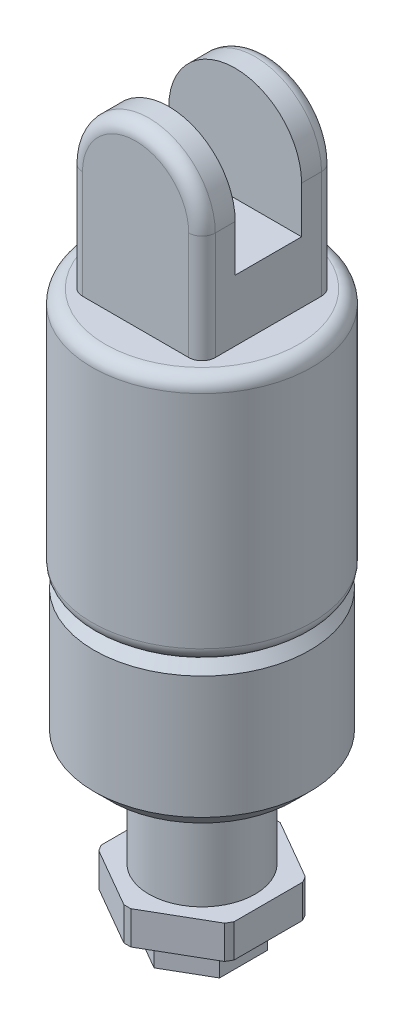
ISO-10303-21;
HEADER;
FILE_DESCRIPTION(('STEP AP214'),'2;1');
FILE_NAME('part.step','',(''),(''),'','','');
FILE_SCHEMA(('AUTOMOTIVE_DESIGN { 1 0 10303 214 1 1 1 1 }'));
ENDSEC;
DATA;
#1=APPLICATION_CONTEXT('core data for automotive mechanical design processes');
#2=APPLICATION_PROTOCOL_DEFINITION('international standard','automotive_design',2000,#1);
#3=PRODUCT_CONTEXT('',#1,'mechanical');
#4=PRODUCT('Part','Part','',(#3));
#5=PRODUCT_RELATED_PRODUCT_CATEGORY('part','',(#4));
#6=PRODUCT_DEFINITION_FORMATION('','',#4);
#7=PRODUCT_DEFINITION_CONTEXT('part definition',#1,'design');
#8=PRODUCT_DEFINITION('design','',#6,#7);
#9=PRODUCT_DEFINITION_SHAPE('','',#8);
#10=(LENGTH_UNIT() NAMED_UNIT(*) SI_UNIT(.MILLI.,.METRE.));
#11=(NAMED_UNIT(*) PLANE_ANGLE_UNIT() SI_UNIT($,.RADIAN.));
#12=(NAMED_UNIT(*) SI_UNIT($,.STERADIAN.) SOLID_ANGLE_UNIT());
#13=UNCERTAINTY_MEASURE_WITH_UNIT(LENGTH_MEASURE(1.E-05),#10,'distance_accuracy_value','');
#14=(GEOMETRIC_REPRESENTATION_CONTEXT(3) GLOBAL_UNCERTAINTY_ASSIGNED_CONTEXT((#13)) GLOBAL_UNIT_ASSIGNED_CONTEXT((#10,
#11,#12)) REPRESENTATION_CONTEXT('',''));
#15=CARTESIAN_POINT('',(0.,0.,0.));
#16=DIRECTION('',(0.,0.,1.));
#17=DIRECTION('',(1.,0.,0.));
#18=AXIS2_PLACEMENT_3D('',#15,#16,#17);
#19=CARTESIAN_POINT('',(0.,30.5,4.));
#20=DIRECTION('',(0.,0.,-1.));
#21=DIRECTION('',(-1.,0.,0.));
#22=AXIS2_PLACEMENT_3D('',#19,#20,#21);
#23=CYLINDRICAL_SURFACE('',#22,4.);
#24=DIRECTION('',(0.,0.,-1.));
#25=VECTOR('',#24,1.);
#26=CARTESIAN_POINT('',(4.,30.5,4.));
#27=LINE('',#26,#25);
#28=CARTESIAN_POINT('',(4.,30.5,3.2));
#29=VERTEX_POINT('',#28);
#30=CARTESIAN_POINT('',(4.,30.5,2.));
#31=VERTEX_POINT('',#30);
#32=EDGE_CURVE('E296',#29,#31,#27,.T.);
#33=ORIENTED_EDGE('',*,*,#32,.T.);
#34=CARTESIAN_POINT('',(0.,30.5,2.));
#35=DIRECTION('',(0.,0.,1.));
#36=DIRECTION('',(0.,-1.,0.));
#37=AXIS2_PLACEMENT_3D('',#34,#35,#36);
#38=CIRCLE('',#37,4.);
#39=CARTESIAN_POINT('',(-4.,30.5,2.));
#40=VERTEX_POINT('',#39);
#41=EDGE_CURVE('E56',#31,#40,#38,.T.);
#42=ORIENTED_EDGE('',*,*,#41,.T.);
#43=DIRECTION('',(0.,0.,-1.));
#44=VECTOR('',#43,1.);
#45=CARTESIAN_POINT('',(-4.,30.5,4.));
#46=LINE('',#45,#44);
#47=CARTESIAN_POINT('',(-4.,30.5,3.2));
#48=VERTEX_POINT('',#47);
#49=EDGE_CURVE('E292',#48,#40,#46,.T.);
#50=ORIENTED_EDGE('',*,*,#49,.F.);
#51=CARTESIAN_POINT('',(0.,30.5,3.2));
#52=DIRECTION('',(0.,0.,1.));
#53=DIRECTION('',(1.,0.,0.));
#54=AXIS2_PLACEMENT_3D('',#51,#52,#53);
#55=CIRCLE('',#54,4.);
#56=EDGE_CURVE('E519',#48,#29,#55,.F.);
#57=ORIENTED_EDGE('',*,*,#56,.T.);
#58=EDGE_LOOP('',(#33,#42,#50,#57));
#59=FACE_BOUND('',#58,.T.);
#60=ADVANCED_FACE('F47',(#59),#23,.T.);
#61=CARTESIAN_POINT('',(3.2,-6.,0.));
#62=DIRECTION('',(0.,-1.,0.));
#63=DIRECTION('',(0.,0.,-1.));
#64=AXIS2_PLACEMENT_3D('',#61,#62,#63);
#65=PLANE('',#64);
#66=CARTESIAN_POINT('',(0.,-6.,0.));
#67=DIRECTION('',(0.,1.,0.));
#68=DIRECTION('',(0.,0.,1.));
#69=AXIS2_PLACEMENT_3D('',#66,#67,#68);
#70=CIRCLE('',#69,3.2);
#71=CARTESIAN_POINT('',(0.,-6.,3.2));
#72=VERTEX_POINT('',#71);
#73=EDGE_CURVE('E440',#72,#72,#70,.T.);
#74=ORIENTED_EDGE('',*,*,#73,.F.);
#75=EDGE_LOOP('',(#74));
#76=FACE_BOUND('',#75,.T.);
#77=DIRECTION('',(-0.866025403784439,0.,0.5));
#78=VECTOR('',#77,1.);
#79=CARTESIAN_POINT('',(4.4,-6.,2.07846096908265));
#80=LINE('',#79,#78);
#81=CARTESIAN_POINT('',(3.78535710713571,-6.,2.43332520873334));
#82=VERTEX_POINT('',#81);
#83=CARTESIAN_POINT('',(0.214642892864287,-6.,4.49487802154217));
#84=VERTEX_POINT('',#83);
#85=EDGE_CURVE('E422',#82,#84,#80,.T.);
#86=ORIENTED_EDGE('',*,*,#85,.F.);
#87=CARTESIAN_POINT('',(0.,-6.,0.));
#88=DIRECTION('',(0.,1.,0.));
#89=DIRECTION('',(0.,0.,1.));
#90=AXIS2_PLACEMENT_3D('',#87,#88,#89);
#91=CIRCLE('',#90,4.5);
#92=CARTESIAN_POINT('',(4.,-6.,2.06155281280883));
#93=VERTEX_POINT('',#92);
#94=EDGE_CURVE('E439',#82,#93,#91,.T.);
#95=ORIENTED_EDGE('',*,*,#94,.T.);
#96=DIRECTION('',(0.,0.,1.));
#97=VECTOR('',#96,1.);
#98=CARTESIAN_POINT('',(4.,-6.,0.));
#99=LINE('',#98,#97);
#100=CARTESIAN_POINT('',(4.,-6.,-2.06155281280883));
#101=VERTEX_POINT('',#100);
#102=EDGE_CURVE('E413',#101,#93,#99,.T.);
#103=ORIENTED_EDGE('',*,*,#102,.F.);
#104=CARTESIAN_POINT('',(3.78535710713571,-6.,-2.43332520873334));
#105=VERTEX_POINT('',#104);
#106=EDGE_CURVE('E824',#101,#105,#91,.T.);
#107=ORIENTED_EDGE('',*,*,#106,.T.);
#108=DIRECTION('',(0.866025403784439,0.,0.5));
#109=VECTOR('',#108,1.);
#110=CARTESIAN_POINT('',(4.4,-6.,-2.07846096908265));
#111=LINE('',#110,#109);
#112=CARTESIAN_POINT('',(0.214642892864289,-6.,-4.49487802154217));
#113=VERTEX_POINT('',#112);
#114=EDGE_CURVE('E404',#113,#105,#111,.T.);
#115=ORIENTED_EDGE('',*,*,#114,.F.);
#116=CARTESIAN_POINT('',(-0.214642892864292,-6.,-4.49487802154217));
#117=VERTEX_POINT('',#116);
#118=EDGE_CURVE('E794',#113,#117,#91,.T.);
#119=ORIENTED_EDGE('',*,*,#118,.T.);
#120=DIRECTION('',(0.866025403784439,0.,-0.5));
#121=VECTOR('',#120,1.);
#122=CARTESIAN_POINT('',(0.399999999999998,-6.,-4.84974226119286));
#123=LINE('',#122,#121);
#124=CARTESIAN_POINT('',(-3.78535710713571,-6.,-2.43332520873334));
#125=VERTEX_POINT('',#124);
#126=EDGE_CURVE('E395',#125,#117,#123,.T.);
#127=ORIENTED_EDGE('',*,*,#126,.F.);
#128=CARTESIAN_POINT('',(-4.,-6.,-2.06155281280883));
#129=VERTEX_POINT('',#128);
#130=EDGE_CURVE('E790',#125,#129,#91,.T.);
#131=ORIENTED_EDGE('',*,*,#130,.T.);
#132=DIRECTION('',(0.,0.,-1.));
#133=VECTOR('',#132,1.);
#134=CARTESIAN_POINT('',(-4.,-6.,0.));
#135=LINE('',#134,#133);
#136=CARTESIAN_POINT('',(-4.,-6.,2.06155281280883));
#137=VERTEX_POINT('',#136);
#138=EDGE_CURVE('E386',#137,#129,#135,.T.);
#139=ORIENTED_EDGE('',*,*,#138,.F.);
#140=CARTESIAN_POINT('',(-3.78535710713571,-6.,2.43332520873334));
#141=VERTEX_POINT('',#140);
#142=EDGE_CURVE('E438',#137,#141,#91,.T.);
#143=ORIENTED_EDGE('',*,*,#142,.T.);
#144=DIRECTION('',(-0.866025403784439,0.,-0.5));
#145=VECTOR('',#144,1.);
#146=CARTESIAN_POINT('',(0.400000000000001,-6.,4.84974226119286));
#147=LINE('',#146,#145);
#148=CARTESIAN_POINT('',(-0.214642892864286,-6.,4.49487802154217));
#149=VERTEX_POINT('',#148);
#150=EDGE_CURVE('E377',#149,#141,#147,.T.);
#151=ORIENTED_EDGE('',*,*,#150,.F.);
#152=EDGE_CURVE('E434',#149,#84,#91,.T.);
#153=ORIENTED_EDGE('',*,*,#152,.T.);
#154=EDGE_LOOP('',(#86,#95,#103,#107,#115,#119,#127,#131,#139,#143,#151,#153));
#155=FACE_BOUND('',#154,.T.);
#156=ADVANCED_FACE('F601',(#76,#155),#65,.F.);
#157=CARTESIAN_POINT('',(0.,0.,0.));
#158=DIRECTION('',(0.,1.,0.));
#159=DIRECTION('',(0.,0.,1.));
#160=AXIS2_PLACEMENT_3D('',#157,#158,#159);
#161=CYLINDRICAL_SURFACE('',#160,4.5);
#162=DIRECTION('',(0.,1.,0.));
#163=VECTOR('',#162,1.);
#164=CARTESIAN_POINT('',(3.78535710713571,0.,2.43332520873334));
#165=LINE('',#164,#163);
#166=CARTESIAN_POINT('',(3.78535710713571,-8.,2.43332520873334));
#167=VERTEX_POINT('',#166);
#168=EDGE_CURVE('E425',#167,#82,#165,.T.);
#169=ORIENTED_EDGE('',*,*,#168,.F.);
#170=CARTESIAN_POINT('',(0.,-8.,0.));
#171=DIRECTION('',(0.,1.,0.));
#172=DIRECTION('',(0.,0.,1.));
#173=AXIS2_PLACEMENT_3D('',#170,#171,#172);
#174=CIRCLE('',#173,4.5);
#175=CARTESIAN_POINT('',(4.,-8.,2.06155281280883));
#176=VERTEX_POINT('',#175);
#177=EDGE_CURVE('E433',#167,#176,#174,.T.);
#178=ORIENTED_EDGE('',*,*,#177,.T.);
#179=DIRECTION('',(0.,1.,0.));
#180=VECTOR('',#179,1.);
#181=CARTESIAN_POINT('',(4.,0.,2.06155281280883));
#182=LINE('',#181,#180);
#183=EDGE_CURVE('E410',#93,#176,#182,.F.);
#184=ORIENTED_EDGE('',*,*,#183,.F.);
#185=ORIENTED_EDGE('',*,*,#94,.F.);
#186=EDGE_LOOP('',(#169,#178,#184,#185));
#187=FACE_BOUND('',#186,.T.);
#188=ADVANCED_FACE('F607',(#187),#161,.T.);
#189=DIRECTION('',(0.,1.,0.));
#190=VECTOR('',#189,1.);
#191=CARTESIAN_POINT('',(0.214642892864287,0.,4.49487802154217));
#192=LINE('',#191,#190);
#193=CARTESIAN_POINT('',(0.214642892864289,-8.,4.49487802154217));
#194=VERTEX_POINT('',#193);
#195=EDGE_CURVE('E419',#84,#194,#192,.F.);
#196=ORIENTED_EDGE('',*,*,#195,.F.);
#197=ORIENTED_EDGE('',*,*,#152,.F.);
#198=DIRECTION('',(0.,1.,0.));
#199=VECTOR('',#198,1.);
#200=CARTESIAN_POINT('',(-0.214642892864284,0.,4.49487802154217));
#201=LINE('',#200,#199);
#202=CARTESIAN_POINT('',(-0.214642892864286,-8.,4.49487802154217));
#203=VERTEX_POINT('',#202);
#204=EDGE_CURVE('E380',#203,#149,#201,.T.);
#205=ORIENTED_EDGE('',*,*,#204,.F.);
#206=EDGE_CURVE('E428',#203,#194,#174,.T.);
#207=ORIENTED_EDGE('',*,*,#206,.T.);
#208=EDGE_LOOP('',(#196,#197,#205,#207));
#209=FACE_BOUND('',#208,.T.);
#210=ADVANCED_FACE('F673',(#209),#161,.T.);
#211=DIRECTION('',(0.,1.,0.));
#212=VECTOR('',#211,1.);
#213=CARTESIAN_POINT('',(4.,0.,-2.06155281280883));
#214=LINE('',#213,#212);
#215=CARTESIAN_POINT('',(4.,-8.,-2.06155281280883));
#216=VERTEX_POINT('',#215);
#217=EDGE_CURVE('E416',#216,#101,#214,.T.);
#218=ORIENTED_EDGE('',*,*,#217,.F.);
#219=CARTESIAN_POINT('',(3.78535710713571,-8.,-2.43332520873334));
#220=VERTEX_POINT('',#219);
#221=EDGE_CURVE('E806',#216,#220,#174,.T.);
#222=ORIENTED_EDGE('',*,*,#221,.T.);
#223=DIRECTION('',(0.,1.,0.));
#224=VECTOR('',#223,1.);
#225=CARTESIAN_POINT('',(3.78535710713571,0.,-2.43332520873334));
#226=LINE('',#225,#224);
#227=EDGE_CURVE('E401',#105,#220,#226,.F.);
#228=ORIENTED_EDGE('',*,*,#227,.F.);
#229=ORIENTED_EDGE('',*,*,#106,.F.);
#230=EDGE_LOOP('',(#218,#222,#228,#229));
#231=FACE_BOUND('',#230,.T.);
#232=ADVANCED_FACE('F906',(#231),#161,.T.);
#233=DIRECTION('',(0.,1.,0.));
#234=VECTOR('',#233,1.);
#235=CARTESIAN_POINT('',(0.214642892864286,0.,-4.49487802154217));
#236=LINE('',#235,#234);
#237=CARTESIAN_POINT('',(0.214642892864289,-8.,-4.49487802154217));
#238=VERTEX_POINT('',#237);
#239=EDGE_CURVE('E407',#238,#113,#236,.T.);
#240=ORIENTED_EDGE('',*,*,#239,.F.);
#241=CARTESIAN_POINT('',(-0.214642892864292,-8.,-4.49487802154217));
#242=VERTEX_POINT('',#241);
#243=EDGE_CURVE('E802',#238,#242,#174,.T.);
#244=ORIENTED_EDGE('',*,*,#243,.T.);
#245=DIRECTION('',(0.,1.,0.));
#246=VECTOR('',#245,1.);
#247=CARTESIAN_POINT('',(-0.214642892864292,0.,-4.49487802154217));
#248=LINE('',#247,#246);
#249=EDGE_CURVE('E392',#117,#242,#248,.F.);
#250=ORIENTED_EDGE('',*,*,#249,.F.);
#251=ORIENTED_EDGE('',*,*,#118,.F.);
#252=EDGE_LOOP('',(#240,#244,#250,#251));
#253=FACE_BOUND('',#252,.T.);
#254=ADVANCED_FACE('F860',(#253),#161,.T.);
#255=DIRECTION('',(0.,1.,0.));
#256=VECTOR('',#255,1.);
#257=CARTESIAN_POINT('',(-3.78535710713571,0.,-2.43332520873334));
#258=LINE('',#257,#256);
#259=CARTESIAN_POINT('',(-3.78535710713571,-8.,-2.43332520873334));
#260=VERTEX_POINT('',#259);
#261=EDGE_CURVE('E398',#260,#125,#258,.T.);
#262=ORIENTED_EDGE('',*,*,#261,.F.);
#263=CARTESIAN_POINT('',(-4.,-8.,-2.06155281280883));
#264=VERTEX_POINT('',#263);
#265=EDGE_CURVE('E787',#260,#264,#174,.T.);
#266=ORIENTED_EDGE('',*,*,#265,.T.);
#267=DIRECTION('',(0.,1.,0.));
#268=VECTOR('',#267,1.);
#269=CARTESIAN_POINT('',(-4.,0.,-2.06155281280883));
#270=LINE('',#269,#268);
#271=EDGE_CURVE('E383',#129,#264,#270,.F.);
#272=ORIENTED_EDGE('',*,*,#271,.F.);
#273=ORIENTED_EDGE('',*,*,#130,.F.);
#274=EDGE_LOOP('',(#262,#266,#272,#273));
#275=FACE_BOUND('',#274,.T.);
#276=ADVANCED_FACE('F913',(#275),#161,.T.);
#277=DIRECTION('',(0.,1.,0.));
#278=VECTOR('',#277,1.);
#279=CARTESIAN_POINT('',(-4.,0.,2.06155281280883));
#280=LINE('',#279,#278);
#281=CARTESIAN_POINT('',(-4.,-8.,2.06155281280883));
#282=VERTEX_POINT('',#281);
#283=EDGE_CURVE('E389',#282,#137,#280,.T.);
#284=ORIENTED_EDGE('',*,*,#283,.F.);
#285=CARTESIAN_POINT('',(-3.78535710713571,-8.,2.43332520873334));
#286=VERTEX_POINT('',#285);
#287=EDGE_CURVE('E432',#282,#286,#174,.T.);
#288=ORIENTED_EDGE('',*,*,#287,.T.);
#289=DIRECTION('',(0.,1.,0.));
#290=VECTOR('',#289,1.);
#291=CARTESIAN_POINT('',(-3.78535710713571,0.,2.43332520873334));
#292=LINE('',#291,#290);
#293=EDGE_CURVE('E350',#141,#286,#292,.F.);
#294=ORIENTED_EDGE('',*,*,#293,.F.);
#295=ORIENTED_EDGE('',*,*,#142,.F.);
#296=EDGE_LOOP('',(#284,#288,#294,#295));
#297=FACE_BOUND('',#296,.T.);
#298=ADVANCED_FACE('F670',(#297),#161,.T.);
#299=CARTESIAN_POINT('',(4.5,-8.,0.));
#300=DIRECTION('',(0.,1.,0.));
#301=DIRECTION('',(0.,0.,1.));
#302=AXIS2_PLACEMENT_3D('',#299,#300,#301);
#303=PLANE('',#302);
#304=DIRECTION('',(0.866025403784439,0.,-0.5));
#305=VECTOR('',#304,1.);
#306=CARTESIAN_POINT('',(5.375,-8.,1.51554445662277));
#307=LINE('',#306,#305);
#308=EDGE_CURVE('E495',#194,#167,#307,.T.);
#309=ORIENTED_EDGE('',*,*,#308,.F.);
#310=ORIENTED_EDGE('',*,*,#206,.F.);
#311=DIRECTION('',(0.866025403784439,0.,0.5));
#312=VECTOR('',#311,1.);
#313=CARTESIAN_POINT('',(1.375,-8.,5.41265877365274));
#314=LINE('',#313,#312);
#315=EDGE_CURVE('E480',#286,#203,#314,.T.);
#316=ORIENTED_EDGE('',*,*,#315,.F.);
#317=ORIENTED_EDGE('',*,*,#287,.F.);
#318=DIRECTION('',(0.,0.,1.));
#319=VECTOR('',#318,1.);
#320=CARTESIAN_POINT('',(-4.,-8.,0.));
#321=LINE('',#320,#319);
#322=EDGE_CURVE('E483',#264,#282,#321,.T.);
#323=ORIENTED_EDGE('',*,*,#322,.F.);
#324=ORIENTED_EDGE('',*,*,#265,.F.);
#325=DIRECTION('',(-0.866025403784439,0.,0.5));
#326=VECTOR('',#325,1.);
#327=CARTESIAN_POINT('',(1.375,-8.,-5.41265877365274));
#328=LINE('',#327,#326);
#329=EDGE_CURVE('E486',#242,#260,#328,.T.);
#330=ORIENTED_EDGE('',*,*,#329,.F.);
#331=ORIENTED_EDGE('',*,*,#243,.F.);
#332=DIRECTION('',(-0.866025403784439,0.,-0.5));
#333=VECTOR('',#332,1.);
#334=CARTESIAN_POINT('',(5.375,-8.,-1.51554445662277));
#335=LINE('',#334,#333);
#336=EDGE_CURVE('E489',#220,#238,#335,.T.);
#337=ORIENTED_EDGE('',*,*,#336,.F.);
#338=ORIENTED_EDGE('',*,*,#221,.F.);
#339=DIRECTION('',(0.,0.,-1.));
#340=VECTOR('',#339,1.);
#341=CARTESIAN_POINT('',(4.,-8.,0.));
#342=LINE('',#341,#340);
#343=EDGE_CURVE('E492',#176,#216,#342,.T.);
#344=ORIENTED_EDGE('',*,*,#343,.F.);
#345=ORIENTED_EDGE('',*,*,#177,.F.);
#346=EDGE_LOOP('',(#309,#310,#316,#317,#323,#324,#330,#331,#337,#338,#344,#345));
#347=FACE_BOUND('',#346,.T.);
#348=DIRECTION('',(0.,0.,1.));
#349=VECTOR('',#348,1.);
#350=CARTESIAN_POINT('',(2.5,-8.,-1.44337567297407));
#351=LINE('',#350,#349);
#352=CARTESIAN_POINT('',(2.5,-8.,-1.44337567297407));
#353=VERTEX_POINT('',#352);
#354=CARTESIAN_POINT('',(2.5,-8.,1.44337567297407));
#355=VERTEX_POINT('',#354);
#356=EDGE_CURVE('E333',#353,#355,#351,.T.);
#357=ORIENTED_EDGE('',*,*,#356,.F.);
#358=DIRECTION('',(0.866025403784439,0.,0.5));
#359=VECTOR('',#358,1.);
#360=CARTESIAN_POINT('',(0.,-8.,-2.88675134594813));
#361=LINE('',#360,#359);
#362=CARTESIAN_POINT('',(0.,-8.,-2.88675134594813));
#363=VERTEX_POINT('',#362);
#364=EDGE_CURVE('E346',#363,#353,#361,.T.);
#365=ORIENTED_EDGE('',*,*,#364,.F.);
#366=DIRECTION('',(0.866025403784439,0.,-0.5));
#367=VECTOR('',#366,1.);
#368=CARTESIAN_POINT('',(-2.5,-8.,-1.44337567297406));
#369=LINE('',#368,#367);
#370=CARTESIAN_POINT('',(-2.5,-8.,-1.44337567297406));
#371=VERTEX_POINT('',#370);
#372=EDGE_CURVE('E351',#371,#363,#369,.T.);
#373=ORIENTED_EDGE('',*,*,#372,.F.);
#374=DIRECTION('',(0.,0.,-1.));
#375=VECTOR('',#374,1.);
#376=CARTESIAN_POINT('',(-2.5,-8.,1.44337567297407));
#377=LINE('',#376,#375);
#378=CARTESIAN_POINT('',(-2.5,-8.,1.44337567297407));
#379=VERTEX_POINT('',#378);
#380=EDGE_CURVE('E355',#379,#371,#377,.T.);
#381=ORIENTED_EDGE('',*,*,#380,.F.);
#382=DIRECTION('',(-0.866025403784439,0.,-0.5));
#383=VECTOR('',#382,1.);
#384=CARTESIAN_POINT('',(0.,-8.,2.88675134594813));
#385=LINE('',#384,#383);
#386=CARTESIAN_POINT('',(0.,-8.,2.88675134594813));
#387=VERTEX_POINT('',#386);
#388=EDGE_CURVE('E342',#387,#379,#385,.T.);
#389=ORIENTED_EDGE('',*,*,#388,.F.);
#390=DIRECTION('',(-0.866025403784439,0.,0.5));
#391=VECTOR('',#390,1.);
#392=CARTESIAN_POINT('',(2.5,-8.,1.44337567297407));
#393=LINE('',#392,#391);
#394=EDGE_CURVE('E338',#355,#387,#393,.T.);
#395=ORIENTED_EDGE('',*,*,#394,.F.);
#396=EDGE_LOOP('',(#357,#365,#373,#381,#389,#395));
#397=FACE_BOUND('',#396,.T.);
#398=ADVANCED_FACE('F667',(#347,#397),#303,.F.);
#399=CARTESIAN_POINT('',(6.625,24.,0.));
#400=DIRECTION('',(0.,1.,0.));
#401=DIRECTION('',(0.,0.,1.));
#402=AXIS2_PLACEMENT_3D('',#399,#400,#401);
#403=PLANE('',#402);
#404=DIRECTION('',(1.,0.,0.));
#405=VECTOR('',#404,1.);
#406=CARTESIAN_POINT('',(-4.,24.,4.));
#407=LINE('',#406,#405);
#408=CARTESIAN_POINT('',(-3.2,24.,4.));
#409=VERTEX_POINT('',#408);
#410=CARTESIAN_POINT('',(3.2,24.,4.));
#411=VERTEX_POINT('',#410);
#412=EDGE_CURVE('E282',#409,#411,#407,.T.);
#413=ORIENTED_EDGE('',*,*,#412,.F.);
#414=CARTESIAN_POINT('',(-3.2,24.,3.2));
#415=DIRECTION('',(0.,1.,0.));
#416=DIRECTION('',(0.,0.,1.));
#417=AXIS2_PLACEMENT_3D('',#414,#415,#416);
#418=CIRCLE('',#417,0.8);
#419=CARTESIAN_POINT('',(-4.,24.,3.2));
#420=VERTEX_POINT('',#419);
#421=EDGE_CURVE('E70',#409,#420,#418,.F.);
#422=ORIENTED_EDGE('',*,*,#421,.T.);
#423=DIRECTION('',(0.,0.,-1.));
#424=VECTOR('',#423,1.);
#425=CARTESIAN_POINT('',(-4.,24.,4.));
#426=LINE('',#425,#424);
#427=CARTESIAN_POINT('',(-4.,24.,-3.2));
#428=VERTEX_POINT('',#427);
#429=EDGE_CURVE('E304',#420,#428,#426,.T.);
#430=ORIENTED_EDGE('',*,*,#429,.T.);
#431=CARTESIAN_POINT('',(-3.2,24.,-3.2));
#432=DIRECTION('',(0.,1.,0.));
#433=DIRECTION('',(0.,0.,1.));
#434=AXIS2_PLACEMENT_3D('',#431,#432,#433);
#435=CIRCLE('',#434,0.8);
#436=CARTESIAN_POINT('',(-3.2,24.,-4.));
#437=VERTEX_POINT('',#436);
#438=EDGE_CURVE('E544',#428,#437,#435,.F.);
#439=ORIENTED_EDGE('',*,*,#438,.T.);
#440=DIRECTION('',(1.,0.,0.));
#441=VECTOR('',#440,1.);
#442=CARTESIAN_POINT('',(-4.,24.,-4.));
#443=LINE('',#442,#441);
#444=CARTESIAN_POINT('',(3.2,24.,-4.));
#445=VERTEX_POINT('',#444);
#446=EDGE_CURVE('E287',#437,#445,#443,.T.);
#447=ORIENTED_EDGE('',*,*,#446,.T.);
#448=CARTESIAN_POINT('',(3.2,24.,-3.2));
#449=DIRECTION('',(0.,1.,0.));
#450=DIRECTION('',(0.,0.,1.));
#451=AXIS2_PLACEMENT_3D('',#448,#449,#450);
#452=CIRCLE('',#451,0.8);
#453=CARTESIAN_POINT('',(4.,24.,-3.2));
#454=VERTEX_POINT('',#453);
#455=EDGE_CURVE('E539',#445,#454,#452,.F.);
#456=ORIENTED_EDGE('',*,*,#455,.T.);
#457=DIRECTION('',(0.,0.,-1.));
#458=VECTOR('',#457,1.);
#459=CARTESIAN_POINT('',(4.,24.,4.));
#460=LINE('',#459,#458);
#461=CARTESIAN_POINT('',(4.,24.,3.2));
#462=VERTEX_POINT('',#461);
#463=EDGE_CURVE('E300',#462,#454,#460,.T.);
#464=ORIENTED_EDGE('',*,*,#463,.F.);
#465=CARTESIAN_POINT('',(3.2,24.,3.2));
#466=DIRECTION('',(0.,1.,0.));
#467=DIRECTION('',(0.,0.,1.));
#468=AXIS2_PLACEMENT_3D('',#465,#466,#467);
#469=CIRCLE('',#468,0.8);
#470=EDGE_CURVE('E536',#462,#411,#469,.F.);
#471=ORIENTED_EDGE('',*,*,#470,.T.);
#472=EDGE_LOOP('',(#413,#422,#430,#439,#447,#456,#464,#471));
#473=FACE_BOUND('',#472,.T.);
#474=CARTESIAN_POINT('',(0.,24.,0.));
#475=DIRECTION('',(0.,1.,0.));
#476=DIRECTION('',(0.,0.,1.));
#477=AXIS2_PLACEMENT_3D('',#474,#475,#476);
#478=CIRCLE('',#477,5.825);
#479=CARTESIAN_POINT('',(0.,24.,5.825));
#480=VERTEX_POINT('',#479);
#481=EDGE_CURVE('E468',#480,#480,#478,.T.);
#482=ORIENTED_EDGE('',*,*,#481,.T.);
#483=EDGE_LOOP('',(#482));
#484=FACE_BOUND('',#483,.T.);
#485=ADVANCED_FACE('F582',(#473,#484),#403,.T.);
#486=CARTESIAN_POINT('',(0.,0.,0.));
#487=DIRECTION('',(0.,-1.,0.));
#488=DIRECTION('',(0.,0.,-1.));
#489=AXIS2_PLACEMENT_3D('',#486,#487,#488);
#490=CYLINDRICAL_SURFACE('',#489,6.625);
#491=CARTESIAN_POINT('',(0.,9.88449987798926,0.));
#492=DIRECTION('',(0.,1.,0.));
#493=DIRECTION('',(0.,0.,1.));
#494=AXIS2_PLACEMENT_3D('',#491,#492,#493);
#495=CIRCLE('',#494,6.625);
#496=CARTESIAN_POINT('',(0.,9.88449987798926,6.625));
#497=VERTEX_POINT('',#496);
#498=EDGE_CURVE('E464',#497,#497,#495,.T.);
#499=ORIENTED_EDGE('',*,*,#498,.T.);
#500=EDGE_LOOP('',(#499));
#501=FACE_BOUND('',#500,.T.);
#502=CARTESIAN_POINT('',(0.,23.2,0.));
#503=DIRECTION('',(0.,1.,0.));
#504=DIRECTION('',(0.,0.,1.));
#505=AXIS2_PLACEMENT_3D('',#502,#503,#504);
#506=CIRCLE('',#505,6.625);
#507=CARTESIAN_POINT('',(0.,23.2,6.625));
#508=VERTEX_POINT('',#507);
#509=EDGE_CURVE('E460',#508,#508,#506,.F.);
#510=ORIENTED_EDGE('',*,*,#509,.T.);
#511=EDGE_LOOP('',(#510));
#512=FACE_BOUND('',#511,.T.);
#513=ADVANCED_FACE('F696',(#501,#512),#490,.T.);
#514=CARTESIAN_POINT('',(0.,9.,0.));
#515=DIRECTION('',(0.,1.,0.));
#516=DIRECTION('',(0.,0.,1.));
#517=AXIS2_PLACEMENT_3D('',#514,#515,#516);
#518=CONICAL_SURFACE('',#517,6.,0.89605538457134);
#519=CARTESIAN_POINT('',(0.,9.25980483043483,0.));
#520=DIRECTION('',(0.,-1.,0.));
#521=DIRECTION('',(0.,0.,-1.));
#522=AXIS2_PLACEMENT_3D('',#519,#520,#521);
#523=CIRCLE('',#522,6.32475603804354);
#524=CARTESIAN_POINT('',(0.,9.25980483043483,-6.32475603804354));
#525=VERTEX_POINT('',#524);
#526=EDGE_CURVE('E456',#525,#525,#523,.T.);
#527=ORIENTED_EDGE('',*,*,#526,.T.);
#528=EDGE_LOOP('',(#527));
#529=FACE_BOUND('',#528,.T.);
#530=CARTESIAN_POINT('',(0.,9.,0.));
#531=DIRECTION('',(0.,-1.,0.));
#532=DIRECTION('',(0.,0.,-1.));
#533=AXIS2_PLACEMENT_3D('',#530,#531,#532);
#534=CIRCLE('',#533,6.);
#535=CARTESIAN_POINT('',(0.,9.,-6.));
#536=VERTEX_POINT('',#535);
#537=EDGE_CURVE('E452',#536,#536,#534,.T.);
#538=ORIENTED_EDGE('',*,*,#537,.F.);
#539=EDGE_LOOP('',(#538));
#540=FACE_BOUND('',#539,.T.);
#541=ADVANCED_FACE('F692',(#529,#540),#518,.T.);
#542=CARTESIAN_POINT('',(0.,8.375,0.));
#543=DIRECTION('',(0.,-1.,0.));
#544=DIRECTION('',(0.,0.,-1.));
#545=AXIS2_PLACEMENT_3D('',#542,#543,#544);
#546=CONICAL_SURFACE('',#545,6.5,0.67474094222355);
#547=ORIENTED_EDGE('',*,*,#537,.T.);
#548=EDGE_LOOP('',(#547));
#549=FACE_BOUND('',#548,.T.);
#550=CARTESIAN_POINT('',(0.,8.375,0.));
#551=DIRECTION('',(0.,-1.,0.));
#552=DIRECTION('',(0.,0.,-1.));
#553=AXIS2_PLACEMENT_3D('',#550,#551,#552);
#554=CIRCLE('',#553,6.5);
#555=CARTESIAN_POINT('',(0.,8.375,-6.5));
#556=VERTEX_POINT('',#555);
#557=EDGE_CURVE('E448',#556,#556,#554,.T.);
#558=ORIENTED_EDGE('',*,*,#557,.F.);
#559=EDGE_LOOP('',(#558));
#560=FACE_BOUND('',#559,.T.);
#561=ADVANCED_FACE('F688',(#549,#560),#546,.T.);
#562=CARTESIAN_POINT('',(0.,0.,0.));
#563=DIRECTION('',(0.,-1.,0.));
#564=DIRECTION('',(0.,0.,-1.));
#565=AXIS2_PLACEMENT_3D('',#562,#563,#564);
#566=CYLINDRICAL_SURFACE('',#565,6.5);
#567=CARTESIAN_POINT('',(0.,1.,0.));
#568=DIRECTION('',(0.,-1.,0.));
#569=DIRECTION('',(0.,0.,-1.));
#570=AXIS2_PLACEMENT_3D('',#567,#568,#569);
#571=CIRCLE('',#570,6.5);
#572=CARTESIAN_POINT('',(0.,1.,-6.5));
#573=VERTEX_POINT('',#572);
#574=EDGE_CURVE('E476',#573,#573,#571,.F.);
#575=ORIENTED_EDGE('',*,*,#574,.T.);
#576=EDGE_LOOP('',(#575));
#577=FACE_BOUND('',#576,.T.);
#578=ORIENTED_EDGE('',*,*,#557,.T.);
#579=EDGE_LOOP('',(#578));
#580=FACE_BOUND('',#579,.T.);
#581=ADVANCED_FACE('F684',(#577,#580),#566,.T.);
#582=CARTESIAN_POINT('',(6.5,0.,0.));
#583=DIRECTION('',(0.,-1.,0.));
#584=DIRECTION('',(0.,0.,-1.));
#585=AXIS2_PLACEMENT_3D('',#582,#583,#584);
#586=PLANE('',#585);
#587=CARTESIAN_POINT('',(0.,0.,0.));
#588=DIRECTION('',(0.,1.,0.));
#589=DIRECTION('',(0.,0.,1.));
#590=AXIS2_PLACEMENT_3D('',#587,#588,#589);
#591=CIRCLE('',#590,3.2);
#592=CARTESIAN_POINT('',(0.,0.,3.2));
#593=VERTEX_POINT('',#592);
#594=EDGE_CURVE('E444',#593,#593,#591,.T.);
#595=ORIENTED_EDGE('',*,*,#594,.T.);
#596=EDGE_LOOP('',(#595));
#597=FACE_BOUND('',#596,.T.);
#598=CARTESIAN_POINT('',(0.,0.,0.));
#599=DIRECTION('',(0.,-1.,0.));
#600=DIRECTION('',(0.,0.,-1.));
#601=AXIS2_PLACEMENT_3D('',#598,#599,#600);
#602=CIRCLE('',#601,5.50000000000001);
#603=CARTESIAN_POINT('',(0.,0.,-5.50000000000001));
#604=VERTEX_POINT('',#603);
#605=EDGE_CURVE('E472',#604,#604,#602,.T.);
#606=ORIENTED_EDGE('',*,*,#605,.T.);
#607=EDGE_LOOP('',(#606));
#608=FACE_BOUND('',#607,.T.);
#609=ADVANCED_FACE('F680',(#597,#608),#586,.T.);
#610=CARTESIAN_POINT('',(0.,9.88449987798926,0.));
#611=DIRECTION('',(0.,1.,0.));
#612=DIRECTION('',(0.,0.,1.));
#613=AXIS2_PLACEMENT_3D('',#610,#611,#612);
#614=TOROIDAL_SURFACE('',#613,5.825,0.8);
#615=ORIENTED_EDGE('',*,*,#498,.F.);
#616=EDGE_LOOP('',(#615));
#617=FACE_BOUND('',#616,.T.);
#618=ORIENTED_EDGE('',*,*,#526,.F.);
#619=EDGE_LOOP('',(#618));
#620=FACE_BOUND('',#619,.T.);
#621=ADVANCED_FACE('F683',(#617,#620),#614,.T.);
#622=CARTESIAN_POINT('',(0.,23.2,0.));
#623=DIRECTION('',(0.,1.,0.));
#624=DIRECTION('',(0.,0.,1.));
#625=AXIS2_PLACEMENT_3D('',#622,#623,#624);
#626=TOROIDAL_SURFACE('',#625,5.825,0.8);
#627=ORIENTED_EDGE('',*,*,#481,.F.);
#628=EDGE_LOOP('',(#627));
#629=FACE_BOUND('',#628,.T.);
#630=ORIENTED_EDGE('',*,*,#509,.F.);
#631=EDGE_LOOP('',(#630));
#632=FACE_BOUND('',#631,.T.);
#633=ADVANCED_FACE('F705',(#629,#632),#626,.T.);
#634=CARTESIAN_POINT('',(0.,0.,0.));
#635=DIRECTION('',(0.,1.,0.));
#636=DIRECTION('',(0.,0.,1.));
#637=AXIS2_PLACEMENT_3D('',#634,#635,#636);
#638=CONICAL_SURFACE('',#637,5.50000000000001,0.785398163397446);
#639=ORIENTED_EDGE('',*,*,#574,.F.);
#640=EDGE_LOOP('',(#639));
#641=FACE_BOUND('',#640,.T.);
#642=ORIENTED_EDGE('',*,*,#605,.F.);
#643=EDGE_LOOP('',(#642));
#644=FACE_BOUND('',#643,.T.);
#645=ADVANCED_FACE('F678',(#641,#644),#638,.T.);
#646=CARTESIAN_POINT('',(0.,0.,0.));
#647=DIRECTION('',(0.,1.,0.));
#648=DIRECTION('',(0.,0.,1.));
#649=AXIS2_PLACEMENT_3D('',#646,#647,#648);
#650=CYLINDRICAL_SURFACE('',#649,3.2);
#651=ORIENTED_EDGE('',*,*,#594,.F.);
#652=EDGE_LOOP('',(#651));
#653=FACE_BOUND('',#652,.T.);
#654=ORIENTED_EDGE('',*,*,#73,.T.);
#655=EDGE_LOOP('',(#654));
#656=FACE_BOUND('',#655,.T.);
#657=ADVANCED_FACE('F659',(#653,#656),#650,.T.);
#658=CARTESIAN_POINT('',(0.,-5.,4.61880215351701));
#659=DIRECTION('',(-0.5,0.,0.866025403784439));
#660=DIRECTION('',(0.866025403784439,0.,0.5));
#661=AXIS2_PLACEMENT_3D('',#658,#659,#660);
#662=PLANE('',#661);
#663=ORIENTED_EDGE('',*,*,#204,.T.);
#664=ORIENTED_EDGE('',*,*,#150,.T.);
#665=ORIENTED_EDGE('',*,*,#293,.T.);
#666=ORIENTED_EDGE('',*,*,#315,.T.);
#667=EDGE_LOOP('',(#663,#664,#665,#666));
#668=FACE_BOUND('',#667,.T.);
#669=ADVANCED_FACE('F655',(#668),#662,.T.);
#670=CARTESIAN_POINT('',(-4.,-5.,2.3094010767585));
#671=DIRECTION('',(-1.,0.,0.));
#672=DIRECTION('',(0.,0.,1.));
#673=AXIS2_PLACEMENT_3D('',#670,#671,#672);
#674=PLANE('',#673);
#675=ORIENTED_EDGE('',*,*,#283,.T.);
#676=ORIENTED_EDGE('',*,*,#138,.T.);
#677=ORIENTED_EDGE('',*,*,#271,.T.);
#678=ORIENTED_EDGE('',*,*,#322,.T.);
#679=EDGE_LOOP('',(#675,#676,#677,#678));
#680=FACE_BOUND('',#679,.T.);
#681=ADVANCED_FACE('F651',(#680),#674,.T.);
#682=CARTESIAN_POINT('',(-4.,-5.,-2.3094010767585));
#683=DIRECTION('',(-0.5,0.,-0.866025403784439));
#684=DIRECTION('',(-0.866025403784439,0.,0.5));
#685=AXIS2_PLACEMENT_3D('',#682,#683,#684);
#686=PLANE('',#685);
#687=ORIENTED_EDGE('',*,*,#261,.T.);
#688=ORIENTED_EDGE('',*,*,#126,.T.);
#689=ORIENTED_EDGE('',*,*,#249,.T.);
#690=ORIENTED_EDGE('',*,*,#329,.T.);
#691=EDGE_LOOP('',(#687,#688,#689,#690));
#692=FACE_BOUND('',#691,.T.);
#693=ADVANCED_FACE('F647',(#692),#686,.T.);
#694=CARTESIAN_POINT('',(0.,-5.,-4.61880215351701));
#695=DIRECTION('',(0.5,0.,-0.866025403784439));
#696=DIRECTION('',(-0.866025403784439,0.,-0.5));
#697=AXIS2_PLACEMENT_3D('',#694,#695,#696);
#698=PLANE('',#697);
#699=ORIENTED_EDGE('',*,*,#239,.T.);
#700=ORIENTED_EDGE('',*,*,#114,.T.);
#701=ORIENTED_EDGE('',*,*,#227,.T.);
#702=ORIENTED_EDGE('',*,*,#336,.T.);
#703=EDGE_LOOP('',(#699,#700,#701,#702));
#704=FACE_BOUND('',#703,.T.);
#705=ADVANCED_FACE('F643',(#704),#698,.T.);
#706=CARTESIAN_POINT('',(4.,-5.,-2.3094010767585));
#707=DIRECTION('',(1.,0.,0.));
#708=DIRECTION('',(0.,0.,-1.));
#709=AXIS2_PLACEMENT_3D('',#706,#707,#708);
#710=PLANE('',#709);
#711=ORIENTED_EDGE('',*,*,#217,.T.);
#712=ORIENTED_EDGE('',*,*,#102,.T.);
#713=ORIENTED_EDGE('',*,*,#183,.T.);
#714=ORIENTED_EDGE('',*,*,#343,.T.);
#715=EDGE_LOOP('',(#711,#712,#713,#714));
#716=FACE_BOUND('',#715,.T.);
#717=ADVANCED_FACE('F640',(#716),#710,.T.);
#718=CARTESIAN_POINT('',(4.,-5.,2.3094010767585));
#719=DIRECTION('',(0.5,0.,0.866025403784439));
#720=DIRECTION('',(0.866025403784439,0.,-0.5));
#721=AXIS2_PLACEMENT_3D('',#718,#719,#720);
#722=PLANE('',#721);
#723=ORIENTED_EDGE('',*,*,#168,.T.);
#724=ORIENTED_EDGE('',*,*,#85,.T.);
#725=ORIENTED_EDGE('',*,*,#195,.T.);
#726=ORIENTED_EDGE('',*,*,#308,.T.);
#727=EDGE_LOOP('',(#723,#724,#725,#726));
#728=FACE_BOUND('',#727,.T.);
#729=ADVANCED_FACE('F638',(#728),#722,.T.);
#730=CARTESIAN_POINT('',(2.5,12.6210918169984,1.44337567297407));
#731=DIRECTION('',(0.5,0.,0.866025403784439));
#732=DIRECTION('',(0.866025403784439,0.,-0.5));
#733=AXIS2_PLACEMENT_3D('',#730,#731,#732);
#734=PLANE('',#733);
#735=ORIENTED_EDGE('',*,*,#394,.T.);
#736=DIRECTION('',(0.,-1.,0.));
#737=VECTOR('',#736,1.);
#738=CARTESIAN_POINT('',(0.,12.6210918169984,2.88675134594813));
#739=LINE('',#738,#737);
#740=CARTESIAN_POINT('',(0.,-10.,2.88675134594813));
#741=VERTEX_POINT('',#740);
#742=EDGE_CURVE('E328',#387,#741,#739,.T.);
#743=ORIENTED_EDGE('',*,*,#742,.T.);
#744=DIRECTION('',(-0.866025403784439,0.,0.5));
#745=VECTOR('',#744,1.);
#746=CARTESIAN_POINT('',(2.5,-10.,1.44337567297407));
#747=LINE('',#746,#745);
#748=CARTESIAN_POINT('',(2.5,-10.,1.44337567297407));
#749=VERTEX_POINT('',#748);
#750=EDGE_CURVE('E334',#749,#741,#747,.T.);
#751=ORIENTED_EDGE('',*,*,#750,.F.);
#752=DIRECTION('',(0.,-1.,0.));
#753=VECTOR('',#752,1.);
#754=CARTESIAN_POINT('',(2.5,12.6210918169984,1.44337567297407));
#755=LINE('',#754,#753);
#756=EDGE_CURVE('E307',#355,#749,#755,.T.);
#757=ORIENTED_EDGE('',*,*,#756,.F.);
#758=EDGE_LOOP('',(#735,#743,#751,#757));
#759=FACE_BOUND('',#758,.T.);
#760=ADVANCED_FACE('F634',(#759),#734,.T.);
#761=CARTESIAN_POINT('',(2.5,12.6210918169984,-1.44337567297407));
#762=DIRECTION('',(1.,0.,0.));
#763=DIRECTION('',(0.,0.,-1.));
#764=AXIS2_PLACEMENT_3D('',#761,#762,#763);
#765=PLANE('',#764);
#766=ORIENTED_EDGE('',*,*,#356,.T.);
#767=ORIENTED_EDGE('',*,*,#756,.T.);
#768=DIRECTION('',(0.,0.,1.));
#769=VECTOR('',#768,1.);
#770=CARTESIAN_POINT('',(2.5,-10.,-1.44337567297407));
#771=LINE('',#770,#769);
#772=CARTESIAN_POINT('',(2.5,-10.,-1.44337567297407));
#773=VERTEX_POINT('',#772);
#774=EDGE_CURVE('E308',#773,#749,#771,.T.);
#775=ORIENTED_EDGE('',*,*,#774,.F.);
#776=DIRECTION('',(0.,-1.,0.));
#777=VECTOR('',#776,1.);
#778=CARTESIAN_POINT('',(2.5,12.6210918169984,-1.44337567297407));
#779=LINE('',#778,#777);
#780=EDGE_CURVE('E313',#353,#773,#779,.T.);
#781=ORIENTED_EDGE('',*,*,#780,.F.);
#782=EDGE_LOOP('',(#766,#767,#775,#781));
#783=FACE_BOUND('',#782,.T.);
#784=ADVANCED_FACE('F630',(#783),#765,.T.);
#785=CARTESIAN_POINT('',(0.,12.6210918169984,-2.88675134594813));
#786=DIRECTION('',(0.5,0.,-0.866025403784439));
#787=DIRECTION('',(-0.866025403784439,0.,-0.5));
#788=AXIS2_PLACEMENT_3D('',#785,#786,#787);
#789=PLANE('',#788);
#790=ORIENTED_EDGE('',*,*,#364,.T.);
#791=ORIENTED_EDGE('',*,*,#780,.T.);
#792=DIRECTION('',(0.866025403784439,0.,0.5));
#793=VECTOR('',#792,1.);
#794=CARTESIAN_POINT('',(0.,-10.,-2.88675134594813));
#795=LINE('',#794,#793);
#796=CARTESIAN_POINT('',(0.,-10.,-2.88675134594813));
#797=VERTEX_POINT('',#796);
#798=EDGE_CURVE('E314',#797,#773,#795,.T.);
#799=ORIENTED_EDGE('',*,*,#798,.F.);
#800=DIRECTION('',(0.,-1.,0.));
#801=VECTOR('',#800,1.);
#802=CARTESIAN_POINT('',(0.,12.6210918169984,-2.88675134594813));
#803=LINE('',#802,#801);
#804=EDGE_CURVE('E312',#363,#797,#803,.T.);
#805=ORIENTED_EDGE('',*,*,#804,.F.);
#806=EDGE_LOOP('',(#790,#791,#799,#805));
#807=FACE_BOUND('',#806,.T.);
#808=ADVANCED_FACE('F626',(#807),#789,.T.);
#809=CARTESIAN_POINT('',(-2.5,12.6210918169984,-1.44337567297406));
#810=DIRECTION('',(-0.5,0.,-0.866025403784439));
#811=DIRECTION('',(-0.866025403784439,0.,0.5));
#812=AXIS2_PLACEMENT_3D('',#809,#810,#811);
#813=PLANE('',#812);
#814=ORIENTED_EDGE('',*,*,#372,.T.);
#815=ORIENTED_EDGE('',*,*,#804,.T.);
#816=DIRECTION('',(0.866025403784439,0.,-0.5));
#817=VECTOR('',#816,1.);
#818=CARTESIAN_POINT('',(-2.5,-10.,-1.44337567297406));
#819=LINE('',#818,#817);
#820=CARTESIAN_POINT('',(-2.5,-10.,-1.44337567297406));
#821=VERTEX_POINT('',#820);
#822=EDGE_CURVE('E319',#821,#797,#819,.T.);
#823=ORIENTED_EDGE('',*,*,#822,.F.);
#824=DIRECTION('',(0.,-1.,0.));
#825=VECTOR('',#824,1.);
#826=CARTESIAN_POINT('',(-2.5,12.6210918169984,-1.44337567297406));
#827=LINE('',#826,#825);
#828=EDGE_CURVE('E318',#371,#821,#827,.T.);
#829=ORIENTED_EDGE('',*,*,#828,.F.);
#830=EDGE_LOOP('',(#814,#815,#823,#829));
#831=FACE_BOUND('',#830,.T.);
#832=ADVANCED_FACE('F622',(#831),#813,.T.);
#833=CARTESIAN_POINT('',(-2.5,12.6210918169984,1.44337567297407));
#834=DIRECTION('',(-1.,0.,0.));
#835=DIRECTION('',(0.,0.,1.));
#836=AXIS2_PLACEMENT_3D('',#833,#834,#835);
#837=PLANE('',#836);
#838=ORIENTED_EDGE('',*,*,#380,.T.);
#839=ORIENTED_EDGE('',*,*,#828,.T.);
#840=DIRECTION('',(0.,0.,-1.));
#841=VECTOR('',#840,1.);
#842=CARTESIAN_POINT('',(-2.5,-10.,1.44337567297407));
#843=LINE('',#842,#841);
#844=CARTESIAN_POINT('',(-2.5,-10.,1.44337567297406));
#845=VERTEX_POINT('',#844);
#846=EDGE_CURVE('E324',#845,#821,#843,.T.);
#847=ORIENTED_EDGE('',*,*,#846,.F.);
#848=DIRECTION('',(0.,-1.,0.));
#849=VECTOR('',#848,1.);
#850=CARTESIAN_POINT('',(-2.5,12.6210918169984,1.44337567297407));
#851=LINE('',#850,#849);
#852=EDGE_CURVE('E323',#379,#845,#851,.T.);
#853=ORIENTED_EDGE('',*,*,#852,.F.);
#854=EDGE_LOOP('',(#838,#839,#847,#853));
#855=FACE_BOUND('',#854,.T.);
#856=ADVANCED_FACE('F618',(#855),#837,.T.);
#857=CARTESIAN_POINT('',(0.,12.6210918169984,2.88675134594813));
#858=DIRECTION('',(-0.5,0.,0.866025403784439));
#859=DIRECTION('',(0.866025403784439,0.,0.5));
#860=AXIS2_PLACEMENT_3D('',#857,#858,#859);
#861=PLANE('',#860);
#862=ORIENTED_EDGE('',*,*,#388,.T.);
#863=ORIENTED_EDGE('',*,*,#852,.T.);
#864=DIRECTION('',(-0.866025403784439,0.,-0.5));
#865=VECTOR('',#864,1.);
#866=CARTESIAN_POINT('',(0.,-10.,2.88675134594813));
#867=LINE('',#866,#865);
#868=EDGE_CURVE('E329',#741,#845,#867,.T.);
#869=ORIENTED_EDGE('',*,*,#868,.F.);
#870=ORIENTED_EDGE('',*,*,#742,.F.);
#871=EDGE_LOOP('',(#862,#863,#869,#870));
#872=FACE_BOUND('',#871,.T.);
#873=ADVANCED_FACE('F615',(#872),#861,.T.);
#874=CARTESIAN_POINT('',(3.25,-10.,0.));
#875=DIRECTION('',(0.,1.,0.));
#876=DIRECTION('',(0.,0.,1.));
#877=AXIS2_PLACEMENT_3D('',#874,#875,#876);
#878=PLANE('',#877);
#879=ORIENTED_EDGE('',*,*,#750,.T.);
#880=ORIENTED_EDGE('',*,*,#868,.T.);
#881=ORIENTED_EDGE('',*,*,#846,.T.);
#882=ORIENTED_EDGE('',*,*,#822,.T.);
#883=ORIENTED_EDGE('',*,*,#798,.T.);
#884=ORIENTED_EDGE('',*,*,#774,.T.);
#885=EDGE_LOOP('',(#879,#880,#881,#882,#883,#884));
#886=FACE_BOUND('',#885,.T.);
#887=ADVANCED_FACE('F614',(#886),#878,.F.);
#888=CARTESIAN_POINT('',(-4.,24.,4.));
#889=DIRECTION('',(1.,0.,0.));
#890=DIRECTION('',(0.,0.,-1.));
#891=AXIS2_PLACEMENT_3D('',#888,#889,#890);
#892=PLANE('',#891);
#893=ORIENTED_EDGE('',*,*,#49,.T.);
#894=DIRECTION('',(0.,-1.,0.));
#895=VECTOR('',#894,1.);
#896=CARTESIAN_POINT('',(-4.,24.,2.));
#897=LINE('',#896,#895);
#898=CARTESIAN_POINT('',(-4.,27.7,2.));
#899=VERTEX_POINT('',#898);
#900=EDGE_CURVE('E270',#40,#899,#897,.T.);
#901=ORIENTED_EDGE('',*,*,#900,.T.);
#902=DIRECTION('',(0.,0.,-1.));
#903=VECTOR('',#902,1.);
#904=CARTESIAN_POINT('',(-4.,27.7,4.));
#905=LINE('',#904,#903);
#906=CARTESIAN_POINT('',(-4.,27.7,-2.));
#907=VERTEX_POINT('',#906);
#908=EDGE_CURVE('E262',#899,#907,#905,.T.);
#909=ORIENTED_EDGE('',*,*,#908,.T.);
#910=DIRECTION('',(0.,1.,0.));
#911=VECTOR('',#910,1.);
#912=CARTESIAN_POINT('',(-4.,24.,-2.));
#913=LINE('',#912,#911);
#914=CARTESIAN_POINT('',(-4.,30.5,-2.));
#915=VERTEX_POINT('',#914);
#916=EDGE_CURVE('E246',#907,#915,#913,.T.);
#917=ORIENTED_EDGE('',*,*,#916,.T.);
#918=CARTESIAN_POINT('',(-4.,30.5,-3.2));
#919=VERTEX_POINT('',#918);
#920=EDGE_CURVE('E286',#915,#919,#46,.T.);
#921=ORIENTED_EDGE('',*,*,#920,.T.);
#922=DIRECTION('',(0.,-1.,0.));
#923=VECTOR('',#922,1.);
#924=CARTESIAN_POINT('',(-4.,24.,-3.2));
#925=LINE('',#924,#923);
#926=EDGE_CURVE('E63',#919,#428,#925,.T.);
#927=ORIENTED_EDGE('',*,*,#926,.T.);
#928=ORIENTED_EDGE('',*,*,#429,.F.);
#929=DIRECTION('',(0.,-1.,0.));
#930=VECTOR('',#929,1.);
#931=CARTESIAN_POINT('',(-4.,30.5,3.2));
#932=LINE('',#931,#930);
#933=EDGE_CURVE('E533',#420,#48,#932,.F.);
#934=ORIENTED_EDGE('',*,*,#933,.T.);
#935=EDGE_LOOP('',(#893,#901,#909,#917,#921,#927,#928,#934));
#936=FACE_BOUND('',#935,.T.);
#937=ADVANCED_FACE('F269',(#936),#892,.F.);
#938=CARTESIAN_POINT('',(4.,24.,4.));
#939=DIRECTION('',(-1.,0.,0.));
#940=DIRECTION('',(0.,0.,1.));
#941=AXIS2_PLACEMENT_3D('',#938,#939,#940);
#942=PLANE('',#941);
#943=DIRECTION('',(0.,0.,1.));
#944=VECTOR('',#943,1.);
#945=CARTESIAN_POINT('',(4.,27.7,4.));
#946=LINE('',#945,#944);
#947=CARTESIAN_POINT('',(4.,27.7,-2.));
#948=VERTEX_POINT('',#947);
#949=CARTESIAN_POINT('',(4.,27.7,2.));
#950=VERTEX_POINT('',#949);
#951=EDGE_CURVE('E12',#948,#950,#946,.T.);
#952=ORIENTED_EDGE('',*,*,#951,.T.);
#953=DIRECTION('',(0.,1.,0.));
#954=VECTOR('',#953,1.);
#955=CARTESIAN_POINT('',(4.,24.,2.));
#956=LINE('',#955,#954);
#957=EDGE_CURVE('E256',#950,#31,#956,.T.);
#958=ORIENTED_EDGE('',*,*,#957,.T.);
#959=ORIENTED_EDGE('',*,*,#32,.F.);
#960=DIRECTION('',(0.,1.,0.));
#961=VECTOR('',#960,1.);
#962=CARTESIAN_POINT('',(4.,24.,3.2));
#963=LINE('',#962,#961);
#964=EDGE_CURVE('E512',#29,#462,#963,.F.);
#965=ORIENTED_EDGE('',*,*,#964,.T.);
#966=ORIENTED_EDGE('',*,*,#463,.T.);
#967=DIRECTION('',(0.,1.,0.));
#968=VECTOR('',#967,1.);
#969=CARTESIAN_POINT('',(4.,24.,-3.2));
#970=LINE('',#969,#968);
#971=CARTESIAN_POINT('',(4.,30.5,-3.2));
#972=VERTEX_POINT('',#971);
#973=EDGE_CURVE('E508',#454,#972,#970,.T.);
#974=ORIENTED_EDGE('',*,*,#973,.T.);
#975=CARTESIAN_POINT('',(4.,30.5,-2.));
#976=VERTEX_POINT('',#975);
#977=EDGE_CURVE('E295',#976,#972,#27,.T.);
#978=ORIENTED_EDGE('',*,*,#977,.F.);
#979=DIRECTION('',(0.,-1.,0.));
#980=VECTOR('',#979,1.);
#981=CARTESIAN_POINT('',(4.,24.,-2.));
#982=LINE('',#981,#980);
#983=EDGE_CURVE('E257',#976,#948,#982,.T.);
#984=ORIENTED_EDGE('',*,*,#983,.T.);
#985=EDGE_LOOP('',(#952,#958,#959,#965,#966,#974,#978,#984));
#986=FACE_BOUND('',#985,.T.);
#987=ADVANCED_FACE('F576',(#986),#942,.F.);
#988=CARTESIAN_POINT('',(0.,30.5,-2.));
#989=DIRECTION('',(0.,0.,-1.));
#990=DIRECTION('',(0.,1.,0.));
#991=AXIS2_PLACEMENT_3D('',#988,#989,#990);
#992=CIRCLE('',#991,4.);
#993=EDGE_CURVE('E252',#915,#976,#992,.T.);
#994=ORIENTED_EDGE('',*,*,#993,.T.);
#995=ORIENTED_EDGE('',*,*,#977,.T.);
#996=CARTESIAN_POINT('',(0.,30.5,-3.2));
#997=DIRECTION('',(0.,0.,1.));
#998=DIRECTION('',(1.,0.,0.));
#999=AXIS2_PLACEMENT_3D('',#996,#997,#998);
#1000=CIRCLE('',#999,4.);
#1001=EDGE_CURVE('E515',#972,#919,#1000,.T.);
#1002=ORIENTED_EDGE('',*,*,#1001,.T.);
#1003=ORIENTED_EDGE('',*,*,#920,.F.);
#1004=EDGE_LOOP('',(#994,#995,#1002,#1003));
#1005=FACE_BOUND('',#1004,.T.);
#1006=ADVANCED_FACE('F588',(#1005),#23,.T.);
#1007=CARTESIAN_POINT('',(0.,30.5,4.));
#1008=DIRECTION('',(0.,0.,1.));
#1009=DIRECTION('',(1.,0.,0.));
#1010=AXIS2_PLACEMENT_3D('',#1007,#1008,#1009);
#1011=PLANE('',#1010);
#1012=ORIENTED_EDGE('',*,*,#412,.T.);
#1013=DIRECTION('',(0.,1.,0.));
#1014=VECTOR('',#1013,1.);
#1015=CARTESIAN_POINT('',(3.2,30.5,4.));
#1016=LINE('',#1015,#1014);
#1017=CARTESIAN_POINT('',(3.2,30.5,4.));
#1018=VERTEX_POINT('',#1017);
#1019=EDGE_CURVE('E504',#411,#1018,#1016,.T.);
#1020=ORIENTED_EDGE('',*,*,#1019,.T.);
#1021=CARTESIAN_POINT('',(0.,30.5,4.));
#1022=DIRECTION('',(0.,0.,1.));
#1023=DIRECTION('',(1.,0.,0.));
#1024=AXIS2_PLACEMENT_3D('',#1021,#1022,#1023);
#1025=CIRCLE('',#1024,3.2);
#1026=CARTESIAN_POINT('',(-3.2,30.5,4.));
#1027=VERTEX_POINT('',#1026);
#1028=EDGE_CURVE('E501',#1018,#1027,#1025,.T.);
#1029=ORIENTED_EDGE('',*,*,#1028,.T.);
#1030=DIRECTION('',(0.,-1.,0.));
#1031=VECTOR('',#1030,1.);
#1032=CARTESIAN_POINT('',(-3.2,24.,4.));
#1033=LINE('',#1032,#1031);
#1034=EDGE_CURVE('E498',#1027,#409,#1033,.T.);
#1035=ORIENTED_EDGE('',*,*,#1034,.T.);
#1036=EDGE_LOOP('',(#1012,#1020,#1029,#1035));
#1037=FACE_BOUND('',#1036,.T.);
#1038=ADVANCED_FACE('F585',(#1037),#1011,.T.);
#1039=CARTESIAN_POINT('',(0.,30.5,-4.));
#1040=DIRECTION('',(0.,0.,1.));
#1041=DIRECTION('',(1.,0.,0.));
#1042=AXIS2_PLACEMENT_3D('',#1039,#1040,#1041);
#1043=PLANE('',#1042);
#1044=CARTESIAN_POINT('',(0.,30.5,-4.));
#1045=DIRECTION('',(0.,0.,1.));
#1046=DIRECTION('',(1.,0.,0.));
#1047=AXIS2_PLACEMENT_3D('',#1044,#1045,#1046);
#1048=CIRCLE('',#1047,3.2);
#1049=CARTESIAN_POINT('',(-3.2,30.5,-4.));
#1050=VERTEX_POINT('',#1049);
#1051=CARTESIAN_POINT('',(3.2,30.5,-4.));
#1052=VERTEX_POINT('',#1051);
#1053=EDGE_CURVE('E525',#1050,#1052,#1048,.F.);
#1054=ORIENTED_EDGE('',*,*,#1053,.T.);
#1055=DIRECTION('',(0.,1.,0.));
#1056=VECTOR('',#1055,1.);
#1057=CARTESIAN_POINT('',(3.2,30.5,-4.));
#1058=LINE('',#1057,#1056);
#1059=EDGE_CURVE('E528',#1052,#445,#1058,.F.);
#1060=ORIENTED_EDGE('',*,*,#1059,.T.);
#1061=ORIENTED_EDGE('',*,*,#446,.F.);
#1062=DIRECTION('',(0.,-1.,0.));
#1063=VECTOR('',#1062,1.);
#1064=CARTESIAN_POINT('',(-3.2,30.5,-4.));
#1065=LINE('',#1064,#1063);
#1066=EDGE_CURVE('E522',#437,#1050,#1065,.F.);
#1067=ORIENTED_EDGE('',*,*,#1066,.T.);
#1068=EDGE_LOOP('',(#1054,#1060,#1061,#1067));
#1069=FACE_BOUND('',#1068,.T.);
#1070=ADVANCED_FACE('F587',(#1069),#1043,.F.);
#1071=CARTESIAN_POINT('',(-3.2,30.5,3.2));
#1072=DIRECTION('',(0.,1.,0.));
#1073=DIRECTION('',(0.,0.,1.));
#1074=AXIS2_PLACEMENT_3D('',#1071,#1072,#1073);
#1075=CYLINDRICAL_SURFACE('',#1074,0.8);
#1076=ORIENTED_EDGE('',*,*,#421,.F.);
#1077=ORIENTED_EDGE('',*,*,#1034,.F.);
#1078=CARTESIAN_POINT('',(-3.2,30.5,3.2));
#1079=DIRECTION('',(0.,1.,0.));
#1080=DIRECTION('',(0.,0.,1.));
#1081=AXIS2_PLACEMENT_3D('',#1078,#1079,#1080);
#1082=CIRCLE('',#1081,0.8);
#1083=EDGE_CURVE('E291',#48,#1027,#1082,.T.);
#1084=ORIENTED_EDGE('',*,*,#1083,.F.);
#1085=ORIENTED_EDGE('',*,*,#933,.F.);
#1086=EDGE_LOOP('',(#1076,#1077,#1084,#1085));
#1087=FACE_BOUND('',#1086,.T.);
#1088=ADVANCED_FACE('F567',(#1087),#1075,.T.);
#1089=CARTESIAN_POINT('',(0.,30.5,3.2));
#1090=DIRECTION('',(0.,0.,1.));
#1091=DIRECTION('',(1.,0.,0.));
#1092=AXIS2_PLACEMENT_3D('',#1089,#1090,#1091);
#1093=TOROIDAL_SURFACE('',#1092,3.2,0.8);
#1094=ORIENTED_EDGE('',*,*,#1083,.T.);
#1095=ORIENTED_EDGE('',*,*,#1028,.F.);
#1096=CARTESIAN_POINT('',(3.2,30.5,3.2));
#1097=DIRECTION('',(0.,-1.,0.));
#1098=DIRECTION('',(0.,0.,-1.));
#1099=AXIS2_PLACEMENT_3D('',#1096,#1097,#1098);
#1100=CIRCLE('',#1099,0.8);
#1101=EDGE_CURVE('E547',#29,#1018,#1100,.T.);
#1102=ORIENTED_EDGE('',*,*,#1101,.F.);
#1103=ORIENTED_EDGE('',*,*,#56,.F.);
#1104=EDGE_LOOP('',(#1094,#1095,#1102,#1103));
#1105=FACE_BOUND('',#1104,.T.);
#1106=ADVANCED_FACE('F573',(#1105),#1093,.T.);
#1107=CARTESIAN_POINT('',(3.2,30.5,3.2));
#1108=DIRECTION('',(0.,-1.,0.));
#1109=DIRECTION('',(0.,0.,-1.));
#1110=AXIS2_PLACEMENT_3D('',#1107,#1108,#1109);
#1111=CYLINDRICAL_SURFACE('',#1110,0.8);
#1112=ORIENTED_EDGE('',*,*,#470,.F.);
#1113=ORIENTED_EDGE('',*,*,#964,.F.);
#1114=ORIENTED_EDGE('',*,*,#1101,.T.);
#1115=ORIENTED_EDGE('',*,*,#1019,.F.);
#1116=EDGE_LOOP('',(#1112,#1113,#1114,#1115));
#1117=FACE_BOUND('',#1116,.T.);
#1118=ADVANCED_FACE('F580',(#1117),#1111,.T.);
#1119=CARTESIAN_POINT('',(-3.2,24.,-3.2));
#1120=DIRECTION('',(0.,-1.,0.));
#1121=DIRECTION('',(0.,0.,-1.));
#1122=AXIS2_PLACEMENT_3D('',#1119,#1120,#1121);
#1123=CYLINDRICAL_SURFACE('',#1122,0.8);
#1124=ORIENTED_EDGE('',*,*,#438,.F.);
#1125=ORIENTED_EDGE('',*,*,#926,.F.);
#1126=CARTESIAN_POINT('',(-3.2,30.5,-3.2));
#1127=DIRECTION('',(0.,1.,0.));
#1128=DIRECTION('',(0.,0.,1.));
#1129=AXIS2_PLACEMENT_3D('',#1126,#1127,#1128);
#1130=CIRCLE('',#1129,0.8);
#1131=EDGE_CURVE('E277',#1050,#919,#1130,.T.);
#1132=ORIENTED_EDGE('',*,*,#1131,.F.);
#1133=ORIENTED_EDGE('',*,*,#1066,.F.);
#1134=EDGE_LOOP('',(#1124,#1125,#1132,#1133));
#1135=FACE_BOUND('',#1134,.T.);
#1136=ADVANCED_FACE('F49',(#1135),#1123,.T.);
#1137=CARTESIAN_POINT('',(0.,30.5,-3.2));
#1138=DIRECTION('',(0.,0.,1.));
#1139=DIRECTION('',(1.,0.,0.));
#1140=AXIS2_PLACEMENT_3D('',#1137,#1138,#1139);
#1141=TOROIDAL_SURFACE('',#1140,3.2,0.8);
#1142=ORIENTED_EDGE('',*,*,#1131,.T.);
#1143=ORIENTED_EDGE('',*,*,#1001,.F.);
#1144=CARTESIAN_POINT('',(3.2,30.5,-3.2));
#1145=DIRECTION('',(0.,-1.,0.));
#1146=DIRECTION('',(0.,0.,-1.));
#1147=AXIS2_PLACEMENT_3D('',#1144,#1145,#1146);
#1148=CIRCLE('',#1147,0.8);
#1149=EDGE_CURVE('E272',#1052,#972,#1148,.T.);
#1150=ORIENTED_EDGE('',*,*,#1149,.F.);
#1151=ORIENTED_EDGE('',*,*,#1053,.F.);
#1152=EDGE_LOOP('',(#1142,#1143,#1150,#1151));
#1153=FACE_BOUND('',#1152,.T.);
#1154=ADVANCED_FACE('F724',(#1153),#1141,.T.);
#1155=CARTESIAN_POINT('',(3.2,24.,-3.2));
#1156=DIRECTION('',(0.,1.,0.));
#1157=DIRECTION('',(0.,0.,1.));
#1158=AXIS2_PLACEMENT_3D('',#1155,#1156,#1157);
#1159=CYLINDRICAL_SURFACE('',#1158,0.8);
#1160=ORIENTED_EDGE('',*,*,#455,.F.);
#1161=ORIENTED_EDGE('',*,*,#1059,.F.);
#1162=ORIENTED_EDGE('',*,*,#1149,.T.);
#1163=ORIENTED_EDGE('',*,*,#973,.F.);
#1164=EDGE_LOOP('',(#1160,#1161,#1162,#1163));
#1165=FACE_BOUND('',#1164,.T.);
#1166=ADVANCED_FACE('F722',(#1165),#1159,.T.);
#1167=CARTESIAN_POINT('',(-6.625,27.7,2.));
#1168=DIRECTION('',(0.,-1.,0.));
#1169=DIRECTION('',(0.,0.,-1.));
#1170=AXIS2_PLACEMENT_3D('',#1167,#1168,#1169);
#1171=PLANE('',#1170);
#1172=DIRECTION('',(1.,0.,0.));
#1173=VECTOR('',#1172,1.);
#1174=CARTESIAN_POINT('',(-6.625,27.7,2.));
#1175=LINE('',#1174,#1173);
#1176=EDGE_CURVE('E265',#899,#950,#1175,.T.);
#1177=ORIENTED_EDGE('',*,*,#1176,.T.);
#1178=ORIENTED_EDGE('',*,*,#951,.F.);
#1179=DIRECTION('',(1.,0.,0.));
#1180=VECTOR('',#1179,1.);
#1181=CARTESIAN_POINT('',(-6.625,27.7,-2.));
#1182=LINE('',#1181,#1180);
#1183=EDGE_CURVE('E250',#907,#948,#1182,.T.);
#1184=ORIENTED_EDGE('',*,*,#1183,.F.);
#1185=ORIENTED_EDGE('',*,*,#908,.F.);
#1186=EDGE_LOOP('',(#1177,#1178,#1184,#1185));
#1187=FACE_BOUND('',#1186,.T.);
#1188=ADVANCED_FACE('F261',(#1187),#1171,.F.);
#1189=CARTESIAN_POINT('',(-6.625,34.5,2.));
#1190=DIRECTION('',(0.,0.,1.));
#1191=DIRECTION('',(0.,-1.,0.));
#1192=AXIS2_PLACEMENT_3D('',#1189,#1190,#1191);
#1193=PLANE('',#1192);
#1194=ORIENTED_EDGE('',*,*,#41,.F.);
#1195=ORIENTED_EDGE('',*,*,#957,.F.);
#1196=ORIENTED_EDGE('',*,*,#1176,.F.);
#1197=ORIENTED_EDGE('',*,*,#900,.F.);
#1198=EDGE_LOOP('',(#1194,#1195,#1196,#1197));
#1199=FACE_BOUND('',#1198,.T.);
#1200=ADVANCED_FACE('F1114',(#1199),#1193,.F.);
#1201=CARTESIAN_POINT('',(-6.625,34.5,-2.));
#1202=DIRECTION('',(0.,0.,-1.));
#1203=DIRECTION('',(0.,1.,0.));
#1204=AXIS2_PLACEMENT_3D('',#1201,#1202,#1203);
#1205=PLANE('',#1204);
#1206=ORIENTED_EDGE('',*,*,#1183,.T.);
#1207=ORIENTED_EDGE('',*,*,#983,.F.);
#1208=ORIENTED_EDGE('',*,*,#993,.F.);
#1209=ORIENTED_EDGE('',*,*,#916,.F.);
#1210=EDGE_LOOP('',(#1206,#1207,#1208,#1209));
#1211=FACE_BOUND('',#1210,.T.);
#1212=ADVANCED_FACE('F248',(#1211),#1205,.F.);
#1213=CLOSED_SHELL('',(#60,#156,#188,#210,#232,#254,#276,#298,#398,#485,#513,#541,#561,#581,
#609,#621,#633,#645,#657,#669,#681,#693,#705,#717,#729,#760,#784,#808,#832,#856,#873,#887,#937,
#987,#1006,#1038,#1070,#1088,#1106,#1118,#1136,#1154,#1166,#1188,#1200,#1212));
#1214=MANIFOLD_SOLID_BREP('B2',#1213);
#1215=ADVANCED_BREP_SHAPE_REPRESENTATION('',(#18,#1214),#14);
#1216=SHAPE_DEFINITION_REPRESENTATION(#9,#1215);
ENDSEC;
END-ISO-10303-21;
